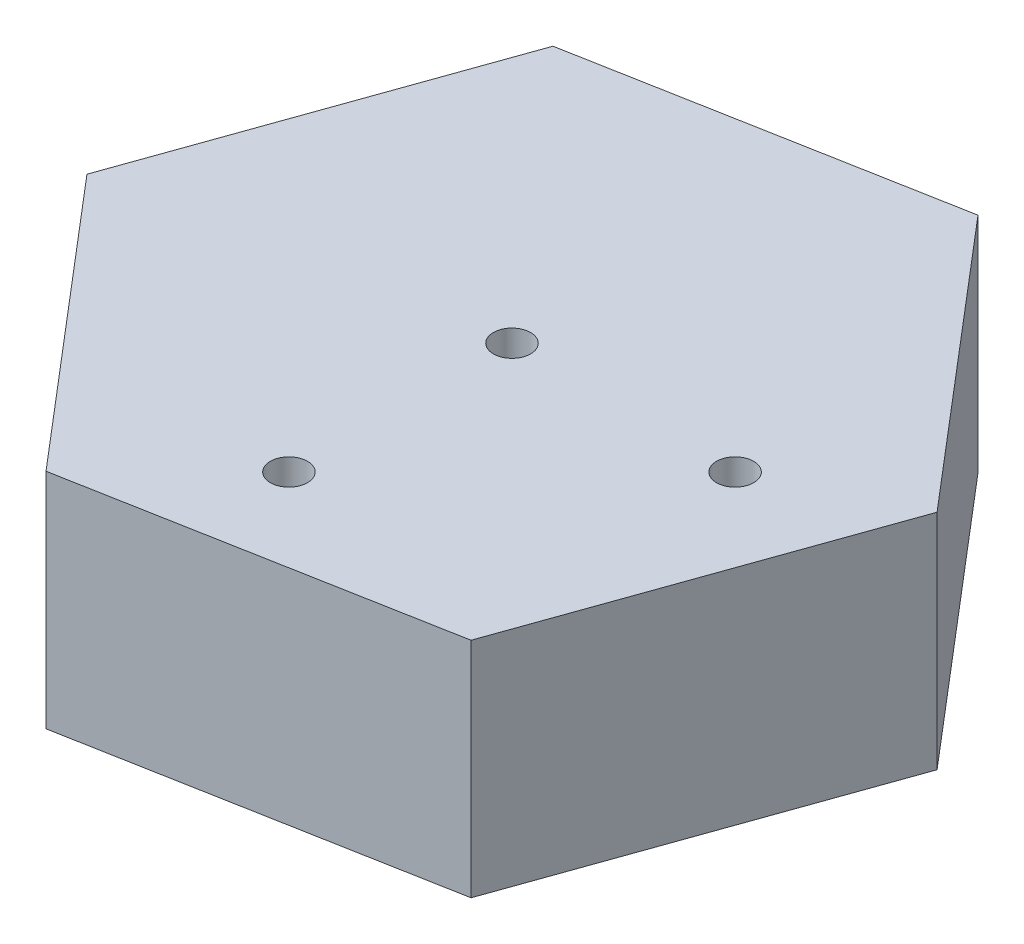
ISO-10303-21;
HEADER;
FILE_DESCRIPTION(('STEP AP214'),'2;1');
FILE_NAME('part.step','',(''),(''),'','','');
FILE_SCHEMA(('AUTOMOTIVE_DESIGN { 1 0 10303 214 1 1 1 1 }'));
ENDSEC;
DATA;
#1=APPLICATION_CONTEXT('core data for automotive mechanical design processes');
#2=APPLICATION_PROTOCOL_DEFINITION('international standard','automotive_design',2000,#1);
#3=PRODUCT_CONTEXT('',#1,'mechanical');
#4=PRODUCT('Part','Part','',(#3));
#5=PRODUCT_RELATED_PRODUCT_CATEGORY('part','',(#4));
#6=PRODUCT_DEFINITION_FORMATION('','',#4);
#7=PRODUCT_DEFINITION_CONTEXT('part definition',#1,'design');
#8=PRODUCT_DEFINITION('design','',#6,#7);
#9=PRODUCT_DEFINITION_SHAPE('','',#8);
#10=(LENGTH_UNIT() NAMED_UNIT(*) SI_UNIT(.MILLI.,.METRE.));
#11=(NAMED_UNIT(*) PLANE_ANGLE_UNIT() SI_UNIT($,.RADIAN.));
#12=(NAMED_UNIT(*) SI_UNIT($,.STERADIAN.) SOLID_ANGLE_UNIT());
#13=UNCERTAINTY_MEASURE_WITH_UNIT(LENGTH_MEASURE(1.E-05),#10,'distance_accuracy_value','');
#14=(GEOMETRIC_REPRESENTATION_CONTEXT(3) GLOBAL_UNCERTAINTY_ASSIGNED_CONTEXT((#13)) GLOBAL_UNIT_ASSIGNED_CONTEXT((#10,
#11,#12)) REPRESENTATION_CONTEXT('',''));
#15=CARTESIAN_POINT('',(0.,0.,0.));
#16=DIRECTION('',(0.,0.,1.));
#17=DIRECTION('',(1.,0.,0.));
#18=AXIS2_PLACEMENT_3D('',#15,#16,#17);
#19=CARTESIAN_POINT('',(16.422602916765,30.,-46.2453397303079));
#20=DIRECTION('',(0.181361583975776,0.,0.983416481384056));
#21=DIRECTION('',(0.983416481384056,0.,-0.181361583975776));
#22=AXIS2_PLACEMENT_3D('',#19,#20,#21);
#23=PLANE('',#22);
#24=DIRECTION('',(-0.983416481384056,0.,0.181361583975776));
#25=VECTOR('',#24,1.);
#26=CARTESIAN_POINT('',(16.422602916765,0.,-46.2453397303079));
#27=LINE('',#26,#25);
#28=CARTESIAN_POINT('',(16.422602916765,0.,-46.2453397303079));
#29=VERTEX_POINT('',#28);
#30=CARTESIAN_POINT('',(-31.8383375547059,0.,-37.3450611873369));
#31=VERTEX_POINT('',#30);
#32=EDGE_CURVE('E128',#29,#31,#27,.T.);
#33=ORIENTED_EDGE('',*,*,#32,.T.);
#34=DIRECTION('',(0.,-1.,0.));
#35=VECTOR('',#34,1.);
#36=CARTESIAN_POINT('',(-31.8383375547059,30.,-37.3450611873369));
#37=LINE('',#36,#35);
#38=CARTESIAN_POINT('',(-31.8383375547059,30.,-37.3450611873369));
#39=VERTEX_POINT('',#38);
#40=EDGE_CURVE('E11',#39,#31,#37,.T.);
#41=ORIENTED_EDGE('',*,*,#40,.F.);
#42=DIRECTION('',(-0.983416481384056,0.,0.181361583975776));
#43=VECTOR('',#42,1.);
#44=CARTESIAN_POINT('',(16.422602916765,30.,-46.2453397303079));
#45=LINE('',#44,#43);
#46=CARTESIAN_POINT('',(16.422602916765,30.,-46.2453397303079));
#47=VERTEX_POINT('',#46);
#48=EDGE_CURVE('E145',#47,#39,#45,.T.);
#49=ORIENTED_EDGE('',*,*,#48,.F.);
#50=DIRECTION('',(0.,-1.,0.));
#51=VECTOR('',#50,1.);
#52=CARTESIAN_POINT('',(16.422602916765,30.,-46.2453397303079));
#53=LINE('',#52,#51);
#54=EDGE_CURVE('E124',#47,#29,#53,.T.);
#55=ORIENTED_EDGE('',*,*,#54,.T.);
#56=EDGE_LOOP('',(#33,#41,#49,#55));
#57=FACE_BOUND('',#56,.T.);
#58=ADVANCED_FACE('F39',(#57),#23,.F.);
#59=CARTESIAN_POINT('',(-31.8383375547059,30.,-37.3450611873369));
#60=DIRECTION('',(0.942344447366787,0.,0.334644501698421));
#61=DIRECTION('',(0.334644501698421,0.,-0.942344447366787));
#62=AXIS2_PLACEMENT_3D('',#59,#60,#61);
#63=PLANE('',#62);
#64=DIRECTION('',(-0.334644501698421,0.,0.942344447366787));
#65=VECTOR('',#64,1.);
#66=CARTESIAN_POINT('',(-31.8383375547059,0.,-37.3450611873369));
#67=LINE('',#66,#65);
#68=CARTESIAN_POINT('',(-48.2609404714709,0.,8.90027854297106));
#69=VERTEX_POINT('',#68);
#70=EDGE_CURVE('E132',#31,#69,#67,.T.);
#71=ORIENTED_EDGE('',*,*,#70,.T.);
#72=DIRECTION('',(0.,-1.,0.));
#73=VECTOR('',#72,1.);
#74=CARTESIAN_POINT('',(-48.2609404714709,30.,8.90027854297106));
#75=LINE('',#74,#73);
#76=CARTESIAN_POINT('',(-48.2609404714709,30.,8.90027854297106));
#77=VERTEX_POINT('',#76);
#78=EDGE_CURVE('E48',#77,#69,#75,.T.);
#79=ORIENTED_EDGE('',*,*,#78,.F.);
#80=DIRECTION('',(-0.334644501698421,0.,0.942344447366787));
#81=VECTOR('',#80,1.);
#82=CARTESIAN_POINT('',(-31.8383375547059,30.,-37.3450611873369));
#83=LINE('',#82,#81);
#84=EDGE_CURVE('E93',#39,#77,#83,.T.);
#85=ORIENTED_EDGE('',*,*,#84,.F.);
#86=ORIENTED_EDGE('',*,*,#40,.T.);
#87=EDGE_LOOP('',(#71,#79,#85,#86));
#88=FACE_BOUND('',#87,.T.);
#89=ADVANCED_FACE('F174',(#88),#63,.F.);
#90=CARTESIAN_POINT('',(-48.2609404714709,30.,8.90027854297106));
#91=DIRECTION('',(0.760982863391011,0.,-0.648771979685635));
#92=DIRECTION('',(-0.648771979685635,0.,-0.760982863391011));
#93=AXIS2_PLACEMENT_3D('',#90,#91,#92);
#94=PLANE('',#93);
#95=DIRECTION('',(0.648771979685635,0.,0.760982863391011));
#96=VECTOR('',#95,1.);
#97=CARTESIAN_POINT('',(-48.2609404714709,0.,8.90027854297106));
#98=LINE('',#97,#96);
#99=CARTESIAN_POINT('',(-16.422602916765,0.,46.2453397303079));
#100=VERTEX_POINT('',#99);
#101=EDGE_CURVE('E136',#69,#100,#98,.T.);
#102=ORIENTED_EDGE('',*,*,#101,.T.);
#103=DIRECTION('',(0.,-1.,0.));
#104=VECTOR('',#103,1.);
#105=CARTESIAN_POINT('',(-16.422602916765,30.,46.2453397303079));
#106=LINE('',#105,#104);
#107=CARTESIAN_POINT('',(-16.422602916765,30.,46.2453397303079));
#108=VERTEX_POINT('',#107);
#109=EDGE_CURVE('E117',#108,#100,#106,.T.);
#110=ORIENTED_EDGE('',*,*,#109,.F.);
#111=DIRECTION('',(0.648771979685635,0.,0.760982863391011));
#112=VECTOR('',#111,1.);
#113=CARTESIAN_POINT('',(-48.2609404714709,30.,8.90027854297106));
#114=LINE('',#113,#112);
#115=EDGE_CURVE('E106',#77,#108,#114,.T.);
#116=ORIENTED_EDGE('',*,*,#115,.F.);
#117=ORIENTED_EDGE('',*,*,#78,.T.);
#118=EDGE_LOOP('',(#102,#110,#116,#117));
#119=FACE_BOUND('',#118,.T.);
#120=ADVANCED_FACE('F155',(#119),#94,.F.);
#121=CARTESIAN_POINT('',(-16.422602916765,30.,46.2453397303079));
#122=DIRECTION('',(-0.181361583975776,0.,-0.983416481384056));
#123=DIRECTION('',(-0.983416481384056,0.,0.181361583975776));
#124=AXIS2_PLACEMENT_3D('',#121,#122,#123);
#125=PLANE('',#124);
#126=DIRECTION('',(0.983416481384056,0.,-0.181361583975776));
#127=VECTOR('',#126,1.);
#128=CARTESIAN_POINT('',(-16.422602916765,0.,46.2453397303079));
#129=LINE('',#128,#127);
#130=CARTESIAN_POINT('',(31.8383375547059,0.,37.3450611873369));
#131=VERTEX_POINT('',#130);
#132=EDGE_CURVE('E115',#100,#131,#129,.T.);
#133=ORIENTED_EDGE('',*,*,#132,.T.);
#134=DIRECTION('',(0.,-1.,0.));
#135=VECTOR('',#134,1.);
#136=CARTESIAN_POINT('',(31.8383375547059,30.,37.3450611873369));
#137=LINE('',#136,#135);
#138=CARTESIAN_POINT('',(31.8383375547059,30.,37.3450611873369));
#139=VERTEX_POINT('',#138);
#140=EDGE_CURVE('E112',#139,#131,#137,.T.);
#141=ORIENTED_EDGE('',*,*,#140,.F.);
#142=DIRECTION('',(0.983416481384056,0.,-0.181361583975776));
#143=VECTOR('',#142,1.);
#144=CARTESIAN_POINT('',(-16.422602916765,30.,46.2453397303079));
#145=LINE('',#144,#143);
#146=EDGE_CURVE('E100',#108,#139,#145,.T.);
#147=ORIENTED_EDGE('',*,*,#146,.F.);
#148=ORIENTED_EDGE('',*,*,#109,.T.);
#149=EDGE_LOOP('',(#133,#141,#147,#148));
#150=FACE_BOUND('',#149,.T.);
#151=ADVANCED_FACE('F113',(#150),#125,.F.);
#152=CARTESIAN_POINT('',(31.8383375547059,30.,37.3450611873369));
#153=DIRECTION('',(-0.942344447366787,0.,-0.334644501698421));
#154=DIRECTION('',(-0.334644501698421,0.,0.942344447366787));
#155=AXIS2_PLACEMENT_3D('',#152,#153,#154);
#156=PLANE('',#155);
#157=DIRECTION('',(0.334644501698421,0.,-0.942344447366787));
#158=VECTOR('',#157,1.);
#159=CARTESIAN_POINT('',(31.8383375547059,0.,37.3450611873369));
#160=LINE('',#159,#158);
#161=CARTESIAN_POINT('',(48.2609404714709,0.,-8.90027854297107));
#162=VERTEX_POINT('',#161);
#163=EDGE_CURVE('E79',#131,#162,#160,.T.);
#164=ORIENTED_EDGE('',*,*,#163,.T.);
#165=DIRECTION('',(0.,-1.,0.));
#166=VECTOR('',#165,1.);
#167=CARTESIAN_POINT('',(48.2609404714709,30.,-8.90027854297107));
#168=LINE('',#167,#166);
#169=CARTESIAN_POINT('',(48.2609404714709,30.,-8.90027854297107));
#170=VERTEX_POINT('',#169);
#171=EDGE_CURVE('E118',#170,#162,#168,.T.);
#172=ORIENTED_EDGE('',*,*,#171,.F.);
#173=DIRECTION('',(0.334644501698421,0.,-0.942344447366787));
#174=VECTOR('',#173,1.);
#175=CARTESIAN_POINT('',(31.8383375547059,30.,37.3450611873369));
#176=LINE('',#175,#174);
#177=EDGE_CURVE('E104',#139,#170,#176,.T.);
#178=ORIENTED_EDGE('',*,*,#177,.F.);
#179=ORIENTED_EDGE('',*,*,#140,.T.);
#180=EDGE_LOOP('',(#164,#172,#178,#179));
#181=FACE_BOUND('',#180,.T.);
#182=ADVANCED_FACE('F120',(#181),#156,.F.);
#183=CARTESIAN_POINT('',(48.2609404714709,30.,-8.90027854297107));
#184=DIRECTION('',(-0.760982863391011,0.,0.648771979685635));
#185=DIRECTION('',(0.648771979685635,0.,0.760982863391011));
#186=AXIS2_PLACEMENT_3D('',#183,#184,#185);
#187=PLANE('',#186);
#188=DIRECTION('',(-0.648771979685635,0.,-0.760982863391011));
#189=VECTOR('',#188,1.);
#190=CARTESIAN_POINT('',(48.2609404714709,0.,-8.90027854297107));
#191=LINE('',#190,#189);
#192=EDGE_CURVE('E85',#162,#29,#191,.T.);
#193=ORIENTED_EDGE('',*,*,#192,.T.);
#194=ORIENTED_EDGE('',*,*,#54,.F.);
#195=DIRECTION('',(-0.648771979685635,0.,-0.760982863391011));
#196=VECTOR('',#195,1.);
#197=CARTESIAN_POINT('',(48.2609404714709,30.,-8.90027854297107));
#198=LINE('',#197,#196);
#199=EDGE_CURVE('E56',#170,#47,#198,.T.);
#200=ORIENTED_EDGE('',*,*,#199,.F.);
#201=ORIENTED_EDGE('',*,*,#171,.T.);
#202=EDGE_LOOP('',(#193,#194,#200,#201));
#203=FACE_BOUND('',#202,.T.);
#204=ADVANCED_FACE('F162',(#203),#187,.F.);
#205=CARTESIAN_POINT('',(0.,30.,0.));
#206=DIRECTION('',(0.,1.,0.));
#207=DIRECTION('',(0.,0.,1.));
#208=AXIS2_PLACEMENT_3D('',#205,#206,#207);
#209=PLANE('',#208);
#210=CARTESIAN_POINT('',(0.,30.,30.));
#211=DIRECTION('',(0.,-1.,0.));
#212=DIRECTION('',(0.,0.,-1.));
#213=AXIS2_PLACEMENT_3D('',#210,#211,#212);
#214=CIRCLE('',#213,2.5);
#215=CARTESIAN_POINT('',(0.,30.,27.5));
#216=VERTEX_POINT('',#215);
#217=EDGE_CURVE('E257',#216,#216,#214,.T.);
#218=ORIENTED_EDGE('',*,*,#217,.T.);
#219=EDGE_LOOP('',(#218));
#220=FACE_BOUND('',#219,.T.);
#221=CARTESIAN_POINT('',(30.,30.,0.));
#222=DIRECTION('',(0.,-1.,0.));
#223=DIRECTION('',(0.,0.,-1.));
#224=AXIS2_PLACEMENT_3D('',#221,#222,#223);
#225=CIRCLE('',#224,2.5);
#226=CARTESIAN_POINT('',(30.,30.,-2.5));
#227=VERTEX_POINT('',#226);
#228=EDGE_CURVE('E262',#227,#227,#225,.T.);
#229=ORIENTED_EDGE('',*,*,#228,.T.);
#230=EDGE_LOOP('',(#229));
#231=FACE_BOUND('',#230,.T.);
#232=CARTESIAN_POINT('',(0.,30.,0.));
#233=DIRECTION('',(0.,1.,0.));
#234=DIRECTION('',(0.,0.,1.));
#235=AXIS2_PLACEMENT_3D('',#232,#233,#234);
#236=CIRCLE('',#235,2.5);
#237=CARTESIAN_POINT('',(0.,30.,2.5));
#238=VERTEX_POINT('',#237);
#239=EDGE_CURVE('E266',#238,#238,#236,.T.);
#240=ORIENTED_EDGE('',*,*,#239,.F.);
#241=EDGE_LOOP('',(#240));
#242=FACE_BOUND('',#241,.T.);
#243=ORIENTED_EDGE('',*,*,#48,.T.);
#244=ORIENTED_EDGE('',*,*,#84,.T.);
#245=ORIENTED_EDGE('',*,*,#115,.T.);
#246=ORIENTED_EDGE('',*,*,#146,.T.);
#247=ORIENTED_EDGE('',*,*,#177,.T.);
#248=ORIENTED_EDGE('',*,*,#199,.T.);
#249=EDGE_LOOP('',(#243,#244,#245,#246,#247,#248));
#250=FACE_BOUND('',#249,.T.);
#251=ADVANCED_FACE('F102',(#220,#231,#242,#250),#209,.T.);
#252=CARTESIAN_POINT('',(0.,0.,0.));
#253=DIRECTION('',(0.,1.,0.));
#254=DIRECTION('',(0.,0.,1.));
#255=AXIS2_PLACEMENT_3D('',#252,#253,#254);
#256=PLANE('',#255);
#257=CARTESIAN_POINT('',(0.,0.,30.));
#258=DIRECTION('',(0.,-1.,0.));
#259=DIRECTION('',(0.,0.,-1.));
#260=AXIS2_PLACEMENT_3D('',#257,#258,#259);
#261=CIRCLE('',#260,2.5);
#262=CARTESIAN_POINT('',(0.,0.,27.5));
#263=VERTEX_POINT('',#262);
#264=EDGE_CURVE('E260',#263,#263,#261,.T.);
#265=ORIENTED_EDGE('',*,*,#264,.F.);
#266=EDGE_LOOP('',(#265));
#267=FACE_BOUND('',#266,.T.);
#268=CARTESIAN_POINT('',(30.,0.,0.));
#269=DIRECTION('',(0.,-1.,0.));
#270=DIRECTION('',(0.,0.,-1.));
#271=AXIS2_PLACEMENT_3D('',#268,#269,#270);
#272=CIRCLE('',#271,2.5);
#273=CARTESIAN_POINT('',(30.,0.,-2.5));
#274=VERTEX_POINT('',#273);
#275=EDGE_CURVE('E269',#274,#274,#272,.T.);
#276=ORIENTED_EDGE('',*,*,#275,.F.);
#277=EDGE_LOOP('',(#276));
#278=FACE_BOUND('',#277,.T.);
#279=ORIENTED_EDGE('',*,*,#32,.F.);
#280=ORIENTED_EDGE('',*,*,#192,.F.);
#281=ORIENTED_EDGE('',*,*,#163,.F.);
#282=ORIENTED_EDGE('',*,*,#132,.F.);
#283=ORIENTED_EDGE('',*,*,#101,.F.);
#284=ORIENTED_EDGE('',*,*,#70,.F.);
#285=EDGE_LOOP('',(#279,#280,#281,#282,#283,#284));
#286=FACE_BOUND('',#285,.T.);
#287=ADVANCED_FACE('F158',(#267,#278,#286),#256,.F.);
#288=CARTESIAN_POINT('',(0.,25.,0.));
#289=DIRECTION('',(0.,1.,0.));
#290=DIRECTION('',(0.,0.,1.));
#291=AXIS2_PLACEMENT_3D('',#288,#289,#290);
#292=CYLINDRICAL_SURFACE('',#291,2.5);
#293=CARTESIAN_POINT('',(0.,25.,0.));
#294=DIRECTION('',(0.,1.,0.));
#295=DIRECTION('',(0.,0.,1.));
#296=AXIS2_PLACEMENT_3D('',#293,#294,#295);
#297=CIRCLE('',#296,2.5);
#298=CARTESIAN_POINT('',(0.,25.,2.5));
#299=VERTEX_POINT('',#298);
#300=EDGE_CURVE('E133',#299,#299,#297,.T.);
#301=ORIENTED_EDGE('',*,*,#300,.F.);
#302=EDGE_LOOP('',(#301));
#303=FACE_BOUND('',#302,.T.);
#304=ORIENTED_EDGE('',*,*,#239,.T.);
#305=EDGE_LOOP('',(#304));
#306=FACE_BOUND('',#305,.T.);
#307=ADVANCED_FACE('F202',(#303,#306),#292,.F.);
#308=CARTESIAN_POINT('',(0.,25.,0.));
#309=DIRECTION('',(0.,1.,0.));
#310=DIRECTION('',(0.,0.,1.));
#311=AXIS2_PLACEMENT_3D('',#308,#309,#310);
#312=PLANE('',#311);
#313=ORIENTED_EDGE('',*,*,#300,.T.);
#314=EDGE_LOOP('',(#313));
#315=FACE_BOUND('',#314,.T.);
#316=ADVANCED_FACE('F207',(#315),#312,.T.);
#317=CARTESIAN_POINT('',(30.,30.,0.));
#318=DIRECTION('',(0.,-1.,0.));
#319=DIRECTION('',(0.,0.,-1.));
#320=AXIS2_PLACEMENT_3D('',#317,#318,#319);
#321=CYLINDRICAL_SURFACE('',#320,2.5);
#322=ORIENTED_EDGE('',*,*,#228,.F.);
#323=EDGE_LOOP('',(#322));
#324=FACE_BOUND('',#323,.T.);
#325=ORIENTED_EDGE('',*,*,#275,.T.);
#326=EDGE_LOOP('',(#325));
#327=FACE_BOUND('',#326,.T.);
#328=ADVANCED_FACE('F219',(#324,#327),#321,.F.);
#329=CARTESIAN_POINT('',(0.,30.,30.));
#330=DIRECTION('',(0.,-1.,0.));
#331=DIRECTION('',(0.,0.,-1.));
#332=AXIS2_PLACEMENT_3D('',#329,#330,#331);
#333=CYLINDRICAL_SURFACE('',#332,2.5);
#334=ORIENTED_EDGE('',*,*,#217,.F.);
#335=EDGE_LOOP('',(#334));
#336=FACE_BOUND('',#335,.T.);
#337=ORIENTED_EDGE('',*,*,#264,.T.);
#338=EDGE_LOOP('',(#337));
#339=FACE_BOUND('',#338,.T.);
#340=ADVANCED_FACE('F240',(#336,#339),#333,.F.);
#341=CLOSED_SHELL('',(#58,#89,#120,#151,#182,#204,#251,#287,#307,#316,#328,#340));
#342=MANIFOLD_SOLID_BREP('B2',#341);
#343=ADVANCED_BREP_SHAPE_REPRESENTATION('',(#18,#342),#14);
#344=SHAPE_DEFINITION_REPRESENTATION(#9,#343);
ENDSEC;
END-ISO-10303-21;
